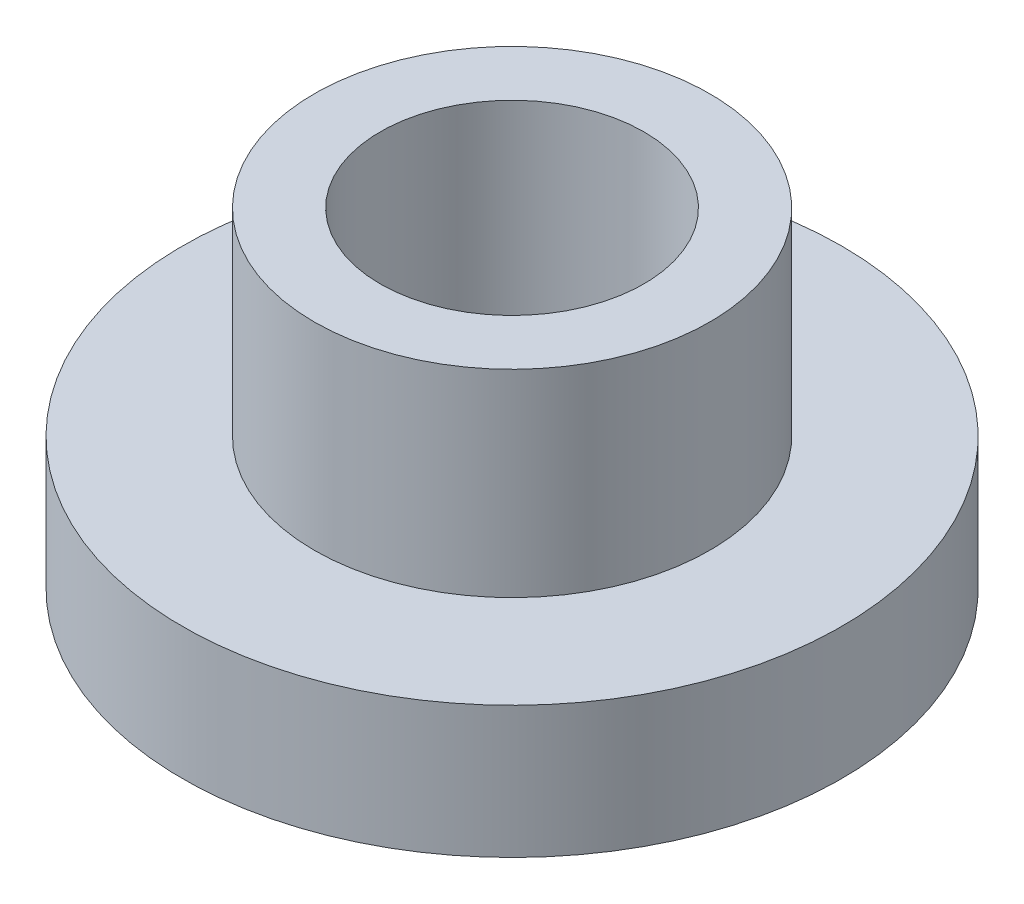
ISO-10303-21;
HEADER;
FILE_DESCRIPTION(('STEP AP214'),'2;1');
FILE_NAME('part.step','',(''),(''),'','','');
FILE_SCHEMA(('AUTOMOTIVE_DESIGN { 1 0 10303 214 1 1 1 1 }'));
ENDSEC;
DATA;
#1=APPLICATION_CONTEXT('core data for automotive mechanical design processes');
#2=APPLICATION_PROTOCOL_DEFINITION('international standard','automotive_design',2000,#1);
#3=PRODUCT_CONTEXT('',#1,'mechanical');
#4=PRODUCT('Part','Part','',(#3));
#5=PRODUCT_RELATED_PRODUCT_CATEGORY('part','',(#4));
#6=PRODUCT_DEFINITION_FORMATION('','',#4);
#7=PRODUCT_DEFINITION_CONTEXT('part definition',#1,'design');
#8=PRODUCT_DEFINITION('design','',#6,#7);
#9=PRODUCT_DEFINITION_SHAPE('','',#8);
#10=(LENGTH_UNIT() NAMED_UNIT(*) SI_UNIT(.MILLI.,.METRE.));
#11=(NAMED_UNIT(*) PLANE_ANGLE_UNIT() SI_UNIT($,.RADIAN.));
#12=(NAMED_UNIT(*) SI_UNIT($,.STERADIAN.) SOLID_ANGLE_UNIT());
#13=UNCERTAINTY_MEASURE_WITH_UNIT(LENGTH_MEASURE(1.E-05),#10,'distance_accuracy_value','');
#14=(GEOMETRIC_REPRESENTATION_CONTEXT(3) GLOBAL_UNCERTAINTY_ASSIGNED_CONTEXT((#13)) GLOBAL_UNIT_ASSIGNED_CONTEXT((#10,
#11,#12)) REPRESENTATION_CONTEXT('',''));
#15=CARTESIAN_POINT('',(0.,0.,0.));
#16=DIRECTION('',(0.,0.,1.));
#17=DIRECTION('',(1.,0.,0.));
#18=AXIS2_PLACEMENT_3D('',#15,#16,#17);
#19=CARTESIAN_POINT('',(0.,1.5,0.));
#20=DIRECTION('',(0.,1.,0.));
#21=DIRECTION('',(0.,0.,1.));
#22=AXIS2_PLACEMENT_3D('',#19,#20,#21);
#23=PLANE('',#22);
#24=CARTESIAN_POINT('',(0.,1.5,0.));
#25=DIRECTION('',(0.,1.,0.));
#26=DIRECTION('',(0.,0.,1.));
#27=AXIS2_PLACEMENT_3D('',#24,#25,#26);
#28=CIRCLE('',#27,1.5);
#29=CARTESIAN_POINT('',(0.,1.5,1.5));
#30=VERTEX_POINT('',#29);
#31=EDGE_CURVE('E10',#30,#30,#28,.T.);
#32=ORIENTED_EDGE('',*,*,#31,.T.);
#33=EDGE_LOOP('',(#32));
#34=FACE_BOUND('',#33,.T.);
#35=CARTESIAN_POINT('',(0.,1.5,0.));
#36=DIRECTION('',(0.,1.,0.));
#37=DIRECTION('',(0.,0.,1.));
#38=AXIS2_PLACEMENT_3D('',#35,#36,#37);
#39=CIRCLE('',#38,1.);
#40=CARTESIAN_POINT('',(0.,1.5,1.));
#41=VERTEX_POINT('',#40);
#42=EDGE_CURVE('E41',#41,#41,#39,.T.);
#43=ORIENTED_EDGE('',*,*,#42,.F.);
#44=EDGE_LOOP('',(#43));
#45=FACE_BOUND('',#44,.T.);
#46=ADVANCED_FACE('F33',(#34,#45),#23,.T.);
#47=CARTESIAN_POINT('',(0.,1.5,0.));
#48=DIRECTION('',(0.,-1.,0.));
#49=DIRECTION('',(0.,0.,-1.));
#50=AXIS2_PLACEMENT_3D('',#47,#48,#49);
#51=CYLINDRICAL_SURFACE('',#50,1.5);
#52=ORIENTED_EDGE('',*,*,#31,.F.);
#53=EDGE_LOOP('',(#52));
#54=FACE_BOUND('',#53,.T.);
#55=CARTESIAN_POINT('',(0.,0.,0.));
#56=DIRECTION('',(0.,1.,0.));
#57=DIRECTION('',(0.,0.,1.));
#58=AXIS2_PLACEMENT_3D('',#55,#56,#57);
#59=CIRCLE('',#58,1.5);
#60=CARTESIAN_POINT('',(0.,0.,1.5));
#61=VERTEX_POINT('',#60);
#62=EDGE_CURVE('E37',#61,#61,#59,.T.);
#63=ORIENTED_EDGE('',*,*,#62,.T.);
#64=EDGE_LOOP('',(#63));
#65=FACE_BOUND('',#64,.T.);
#66=ADVANCED_FACE('F35',(#54,#65),#51,.T.);
#67=CARTESIAN_POINT('',(0.,1.5,0.));
#68=DIRECTION('',(0.,-1.,0.));
#69=DIRECTION('',(0.,0.,-1.));
#70=AXIS2_PLACEMENT_3D('',#67,#68,#69);
#71=CYLINDRICAL_SURFACE('',#70,1.);
#72=ORIENTED_EDGE('',*,*,#42,.T.);
#73=EDGE_LOOP('',(#72));
#74=FACE_BOUND('',#73,.T.);
#75=CARTESIAN_POINT('',(0.,0.,0.));
#76=DIRECTION('',(0.,1.,0.));
#77=DIRECTION('',(0.,0.,1.));
#78=AXIS2_PLACEMENT_3D('',#75,#76,#77);
#79=CIRCLE('',#78,1.);
#80=CARTESIAN_POINT('',(0.,0.,1.));
#81=VERTEX_POINT('',#80);
#82=EDGE_CURVE('E45',#81,#81,#79,.T.);
#83=ORIENTED_EDGE('',*,*,#82,.F.);
#84=EDGE_LOOP('',(#83));
#85=FACE_BOUND('',#84,.T.);
#86=ADVANCED_FACE('F78',(#74,#85),#71,.F.);
#87=CARTESIAN_POINT('',(0.,0.,0.));
#88=DIRECTION('',(0.,-1.,0.));
#89=DIRECTION('',(0.,0.,-1.));
#90=AXIS2_PLACEMENT_3D('',#87,#88,#89);
#91=PLANE('',#90);
#92=ORIENTED_EDGE('',*,*,#82,.T.);
#93=EDGE_LOOP('',(#92));
#94=FACE_BOUND('',#93,.T.);
#95=ADVANCED_FACE('F66',(#94),#91,.F.);
#96=CARTESIAN_POINT('',(0.,-1.,0.));
#97=DIRECTION('',(0.,1.,0.));
#98=DIRECTION('',(0.,0.,1.));
#99=AXIS2_PLACEMENT_3D('',#96,#97,#98);
#100=CYLINDRICAL_SURFACE('',#99,2.5);
#101=CARTESIAN_POINT('',(0.,-1.,0.));
#102=DIRECTION('',(0.,-1.,0.));
#103=DIRECTION('',(0.,0.,-1.));
#104=AXIS2_PLACEMENT_3D('',#101,#102,#103);
#105=CIRCLE('',#104,2.5);
#106=CARTESIAN_POINT('',(0.,-1.,-2.5));
#107=VERTEX_POINT('',#106);
#108=EDGE_CURVE('E53',#107,#107,#105,.T.);
#109=ORIENTED_EDGE('',*,*,#108,.F.);
#110=EDGE_LOOP('',(#109));
#111=FACE_BOUND('',#110,.T.);
#112=CARTESIAN_POINT('',(0.,0.,0.));
#113=DIRECTION('',(0.,-1.,0.));
#114=DIRECTION('',(0.,0.,-1.));
#115=AXIS2_PLACEMENT_3D('',#112,#113,#114);
#116=CIRCLE('',#115,2.5);
#117=CARTESIAN_POINT('',(0.,0.,-2.5));
#118=VERTEX_POINT('',#117);
#119=EDGE_CURVE('E50',#118,#118,#116,.T.);
#120=ORIENTED_EDGE('',*,*,#119,.T.);
#121=EDGE_LOOP('',(#120));
#122=FACE_BOUND('',#121,.T.);
#123=ADVANCED_FACE('F69',(#111,#122),#100,.T.);
#124=CARTESIAN_POINT('',(0.,-1.,0.));
#125=DIRECTION('',(0.,-1.,0.));
#126=DIRECTION('',(0.,0.,-1.));
#127=AXIS2_PLACEMENT_3D('',#124,#125,#126);
#128=PLANE('',#127);
#129=ORIENTED_EDGE('',*,*,#108,.T.);
#130=EDGE_LOOP('',(#129));
#131=FACE_BOUND('',#130,.T.);
#132=ADVANCED_FACE('F64',(#131),#128,.T.);
#133=ORIENTED_EDGE('',*,*,#62,.F.);
#134=EDGE_LOOP('',(#133));
#135=FACE_BOUND('',#134,.T.);
#136=ORIENTED_EDGE('',*,*,#119,.F.);
#137=EDGE_LOOP('',(#136));
#138=FACE_BOUND('',#137,.T.);
#139=ADVANCED_FACE('F61',(#135,#138),#91,.F.);
#140=CLOSED_SHELL('',(#46,#66,#86,#95,#123,#132,#139));
#141=MANIFOLD_SOLID_BREP('B2',#140);
#142=ADVANCED_BREP_SHAPE_REPRESENTATION('',(#18,#141),#14);
#143=SHAPE_DEFINITION_REPRESENTATION(#9,#142);
ENDSEC;
END-ISO-10303-21;
